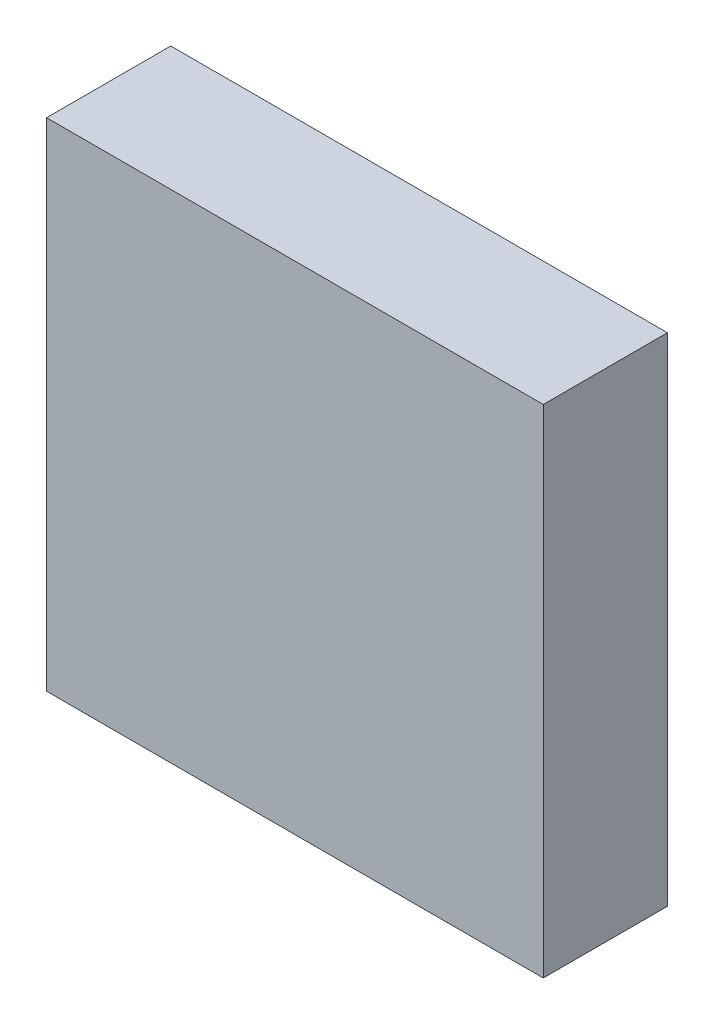
ISO-10303-21;
HEADER;
FILE_DESCRIPTION(('STEP AP214'),'2;1');
FILE_NAME('part.step','',(''),(''),'','','');
FILE_SCHEMA(('AUTOMOTIVE_DESIGN { 1 0 10303 214 1 1 1 1 }'));
ENDSEC;
DATA;
#1=APPLICATION_CONTEXT('core data for automotive mechanical design processes');
#2=APPLICATION_PROTOCOL_DEFINITION('international standard','automotive_design',2000,#1);
#3=PRODUCT_CONTEXT('',#1,'mechanical');
#4=PRODUCT('Part','Part','',(#3));
#5=PRODUCT_RELATED_PRODUCT_CATEGORY('part','',(#4));
#6=PRODUCT_DEFINITION_FORMATION('','',#4);
#7=PRODUCT_DEFINITION_CONTEXT('part definition',#1,'design');
#8=PRODUCT_DEFINITION('design','',#6,#7);
#9=PRODUCT_DEFINITION_SHAPE('','',#8);
#10=(LENGTH_UNIT() NAMED_UNIT(*) SI_UNIT(.MILLI.,.METRE.));
#11=(NAMED_UNIT(*) PLANE_ANGLE_UNIT() SI_UNIT($,.RADIAN.));
#12=(NAMED_UNIT(*) SI_UNIT($,.STERADIAN.) SOLID_ANGLE_UNIT());
#13=UNCERTAINTY_MEASURE_WITH_UNIT(LENGTH_MEASURE(1.E-05),#10,'distance_accuracy_value','');
#14=(GEOMETRIC_REPRESENTATION_CONTEXT(3) GLOBAL_UNCERTAINTY_ASSIGNED_CONTEXT((#13)) GLOBAL_UNIT_ASSIGNED_CONTEXT((#10,
#11,#12)) REPRESENTATION_CONTEXT('',''));
#15=CARTESIAN_POINT('',(0.,0.,0.));
#16=DIRECTION('',(0.,0.,1.));
#17=DIRECTION('',(1.,0.,0.));
#18=AXIS2_PLACEMENT_3D('',#15,#16,#17);
#19=CARTESIAN_POINT('',(-18.6771981276352,20.8309708995125,-0.87499883212488));
#20=CARTESIAN_POINT('',(-15.0771981276352,20.8309707421515,-0.874998832124894));
#21=CARTESIAN_POINT('',(-18.6771981276352,20.8309708208321,0.025001167875118));
#22=CARTESIAN_POINT('',(-15.0771981276352,20.8309706634711,0.0250011678751042));
#23=(BOUNDED_SURFACE() B_SPLINE_SURFACE(1,1,((#19,#20),(#21,#22)),.UNSPECIFIED.,.F.,.F.,
.F.) B_SPLINE_SURFACE_WITH_KNOTS((2,2),(2,2),(-7.5E-05,0.000825),(-0.0033,0.0003),
.UNSPECIFIED.) GEOMETRIC_REPRESENTATION_ITEM() RATIONAL_B_SPLINE_SURFACE(((1.,1.),(1.,1.))) REPRESENTATION_ITEM('') SURFACE());
#24=CARTESIAN_POINT('',(-15.3771981276352,20.8309707487082,-0.799998832124893));
#25=CARTESIAN_POINT('',(-18.3771981276352,20.8309708798424,-0.799998832124881));
#26=(BOUNDED_CURVE() B_SPLINE_CURVE(1,(#24,#25),.UNSPECIFIED.,.F.,
.F.) B_SPLINE_CURVE_WITH_KNOTS((2,2),(0.,0.003),
.UNSPECIFIED.) CURVE() GEOMETRIC_REPRESENTATION_ITEM() RATIONAL_B_SPLINE_CURVE((1.,1.)) REPRESENTATION_ITEM(''));
#27=CARTESIAN_POINT('',(-15.3771981276352,20.8309707487082,-0.799998832124893));
#28=VERTEX_POINT('',#27);
#29=CARTESIAN_POINT('',(-18.3771981276352,20.8309708798424,-0.799998832124881));
#30=VERTEX_POINT('',#29);
#31=EDGE_CURVE('E128',#28,#30,#26,.T.);
#32=CARTESIAN_POINT('',(-18.3771981276352,20.8309708142753,-0.0499988321248832));
#33=CARTESIAN_POINT('',(-18.3771981276352,20.8309708798424,-0.799998832124881));
#34=(BOUNDED_CURVE() B_SPLINE_CURVE(1,(#32,#33),.UNSPECIFIED.,.F.,
.F.) B_SPLINE_CURVE_WITH_KNOTS((2,2),(0.,0.00075),
.UNSPECIFIED.) CURVE() GEOMETRIC_REPRESENTATION_ITEM() RATIONAL_B_SPLINE_CURVE((1.,1.)) REPRESENTATION_ITEM(''));
#35=CARTESIAN_POINT('',(-18.3771981276352,20.8309708142753,-0.0499988321248832));
#36=VERTEX_POINT('',#35);
#37=EDGE_CURVE('E115',#36,#30,#34,.T.);
#38=CARTESIAN_POINT('',(-15.3771981276352,20.8309706831412,-0.0499988321248945));
#39=CARTESIAN_POINT('',(-18.3771981276352,20.8309708142754,-0.049998832124883));
#40=(BOUNDED_CURVE() B_SPLINE_CURVE(1,(#38,#39),.UNSPECIFIED.,.F.,
.F.) B_SPLINE_CURVE_WITH_KNOTS((2,2),(0.,0.003),
.UNSPECIFIED.) CURVE() GEOMETRIC_REPRESENTATION_ITEM() RATIONAL_B_SPLINE_CURVE((1.,1.)) REPRESENTATION_ITEM(''));
#41=CARTESIAN_POINT('',(-15.3771981276352,20.8309706831412,-0.0499988321248945));
#42=VERTEX_POINT('',#41);
#43=EDGE_CURVE('E107',#42,#36,#40,.T.);
#44=CARTESIAN_POINT('',(-15.3771981276352,20.8309706831412,-0.0499988321248945));
#45=CARTESIAN_POINT('',(-15.3771981276352,20.8309707487082,-0.799998832124893));
#46=(BOUNDED_CURVE() B_SPLINE_CURVE(1,(#44,#45),.UNSPECIFIED.,.F.,
.F.) B_SPLINE_CURVE_WITH_KNOTS((2,2),(0.,0.00075),
.UNSPECIFIED.) CURVE() GEOMETRIC_REPRESENTATION_ITEM() RATIONAL_B_SPLINE_CURVE((1.,1.)) REPRESENTATION_ITEM(''));
#47=EDGE_CURVE('E11',#42,#28,#46,.T.);
#48=ORIENTED_EDGE('',*,*,#31,.T.);
#49=ORIENTED_EDGE('',*,*,#37,.F.);
#50=ORIENTED_EDGE('',*,*,#43,.F.);
#51=ORIENTED_EDGE('',*,*,#47,.T.);
#52=EDGE_LOOP('',(#48,#49,#50,#51));
#53=FACE_BOUND('',#52,.T.);
#54=ADVANCED_FACE('F17',(#53),#23,.T.);
#55=CARTESIAN_POINT('',(-15.3771981145218,21.130970755265,-0.874998805898073));
#56=CARTESIAN_POINT('',(-15.3771982718828,17.5309707552649,-0.874999120619915));
#57=CARTESIAN_POINT('',(-15.3771981145218,21.1309706765845,0.0250011941019255));
#58=CARTESIAN_POINT('',(-15.3771982718828,17.5309706765844,0.0250008793800834));
#59=(BOUNDED_SURFACE() B_SPLINE_SURFACE(1,1,((#55,#56),(#57,#58)),.UNSPECIFIED.,.F.,.F.,
.F.) B_SPLINE_SURFACE_WITH_KNOTS((2,2),(2,2),(-7.5E-05,0.000825),(-0.000300000000000009,
0.00330000000000008),
.UNSPECIFIED.) GEOMETRIC_REPRESENTATION_ITEM() RATIONAL_B_SPLINE_SURFACE(((1.,1.),(1.,1.))) REPRESENTATION_ITEM('') SURFACE());
#60=CARTESIAN_POINT('',(-15.3771982587694,17.8309706831412,-0.0499990943930964));
#61=CARTESIAN_POINT('',(-15.3771982587694,17.8309707487082,-0.799999094393094));
#62=(BOUNDED_CURVE() B_SPLINE_CURVE(1,(#60,#61),.UNSPECIFIED.,.F.,
.F.) B_SPLINE_CURVE_WITH_KNOTS((2,2),(0.,0.00075),
.UNSPECIFIED.) CURVE() GEOMETRIC_REPRESENTATION_ITEM() RATIONAL_B_SPLINE_CURVE((1.,1.)) REPRESENTATION_ITEM(''));
#63=CARTESIAN_POINT('',(-15.3771982587694,17.8309706831412,-0.0499990943930964));
#64=VERTEX_POINT('',#63);
#65=CARTESIAN_POINT('',(-15.3771982587694,17.8309707487082,-0.799999094393094));
#66=VERTEX_POINT('',#65);
#67=EDGE_CURVE('E79',#64,#66,#62,.T.);
#68=CARTESIAN_POINT('',(-15.3771981276352,20.8309707487082,-0.799998832124893));
#69=CARTESIAN_POINT('',(-15.3771982587694,17.8309707487082,-0.799999094393095));
#70=(BOUNDED_CURVE() B_SPLINE_CURVE(1,(#68,#69),.UNSPECIFIED.,.F.,
.F.) B_SPLINE_CURVE_WITH_KNOTS((2,2),(0.,0.003),
.UNSPECIFIED.) CURVE() GEOMETRIC_REPRESENTATION_ITEM() RATIONAL_B_SPLINE_CURVE((1.,1.)) REPRESENTATION_ITEM(''));
#71=EDGE_CURVE('E32',#28,#66,#70,.T.);
#72=CARTESIAN_POINT('',(-15.3771981276352,20.8309706831412,-0.0499988321248945));
#73=CARTESIAN_POINT('',(-15.3771982587694,17.8309706831412,-0.0499990943930963));
#74=(BOUNDED_CURVE() B_SPLINE_CURVE(1,(#72,#73),.UNSPECIFIED.,.F.,
.F.) B_SPLINE_CURVE_WITH_KNOTS((2,2),(0.,0.003),
.UNSPECIFIED.) CURVE() GEOMETRIC_REPRESENTATION_ITEM() RATIONAL_B_SPLINE_CURVE((1.,1.)) REPRESENTATION_ITEM(''));
#75=EDGE_CURVE('E116',#42,#64,#74,.T.);
#76=ORIENTED_EDGE('',*,*,#67,.T.);
#77=ORIENTED_EDGE('',*,*,#71,.F.);
#78=ORIENTED_EDGE('',*,*,#47,.F.);
#79=ORIENTED_EDGE('',*,*,#75,.T.);
#80=EDGE_LOOP('',(#76,#77,#78,#79));
#81=FACE_BOUND('',#80,.T.);
#82=ADVANCED_FACE('F226',(#81),#59,.T.);
#83=CARTESIAN_POINT('',(-15.0771981145218,21.1309707355948,-0.799998805898074));
#84=CARTESIAN_POINT('',(-18.6771981145218,21.1309708929558,-0.79999880589806));
#85=CARTESIAN_POINT('',(-15.0771982718828,17.5309707355948,-0.799999120619916));
#86=CARTESIAN_POINT('',(-18.6771982718828,17.5309708929558,-0.799999120619903));
#87=(BOUNDED_SURFACE() B_SPLINE_SURFACE(1,1,((#83,#84),(#85,#86)),.UNSPECIFIED.,.F.,.F.,
.F.) B_SPLINE_SURFACE_WITH_KNOTS((2,2),(2,2),(-0.000300000000000047,0.0033),
(-0.000300000000000005,0.00330000000000004),
.UNSPECIFIED.) GEOMETRIC_REPRESENTATION_ITEM() RATIONAL_B_SPLINE_SURFACE(((1.,1.),(1.,1.))) REPRESENTATION_ITEM('') SURFACE());
#88=CARTESIAN_POINT('',(-17.8771981576868,20.1434708579867,-0.799998892228013));
#89=CARTESIAN_POINT('',(-18.0646981576868,20.1434708661826,-0.799998892228012));
#90=CARTESIAN_POINT('',(-18.0646981494909,20.3309708661826,-0.799998875836249));
#91=CARTESIAN_POINT('',(-18.064698141295,20.5184708661826,-0.799998859444486));
#92=CARTESIAN_POINT('',(-17.877198141295,20.5184708579867,-0.799998859444487));
#93=(BOUNDED_CURVE() B_SPLINE_CURVE(2,(#88,#89,#90,#91,#92),.UNSPECIFIED.,.F.,
.F.) B_SPLINE_CURVE_WITH_KNOTS((3,2,3),(0.,1.57079632679495,3.1415926535898),
.UNSPECIFIED.) CURVE() GEOMETRIC_REPRESENTATION_ITEM() RATIONAL_B_SPLINE_CURVE((1.,
0.707106781186575,1.,0.70710678118663,1.)) REPRESENTATION_ITEM(''));
#94=CARTESIAN_POINT('',(-17.8771981576868,20.1434708579867,-0.799998892228013));
#95=VERTEX_POINT('',#94);
#96=CARTESIAN_POINT('',(-17.877198141295,20.5184708579867,-0.799998859444487));
#97=VERTEX_POINT('',#96);
#98=EDGE_CURVE('E73',#95,#97,#93,.T.);
#99=CARTESIAN_POINT('',(-17.877198141295,20.5184708579867,-0.799998859444487));
#100=CARTESIAN_POINT('',(-17.689698141295,20.5184708497908,-0.799998859444489));
#101=CARTESIAN_POINT('',(-17.6896981494909,20.3309708497908,-0.799998875836251));
#102=CARTESIAN_POINT('',(-17.6896981576868,20.1434708497908,-0.799998892228014));
#103=CARTESIAN_POINT('',(-17.8771981576868,20.1434708579867,-0.799998892228013));
#104=(BOUNDED_CURVE() B_SPLINE_CURVE(2,(#99,#100,#101,#102,#103),.UNSPECIFIED.,.F.,
.F.) B_SPLINE_CURVE_WITH_KNOTS((3,2,3),(3.1415926535898,4.71238898038474,6.28318530717969),
.UNSPECIFIED.) CURVE() GEOMETRIC_REPRESENTATION_ITEM() RATIONAL_B_SPLINE_CURVE((1.,
0.707106781186513,1.,0.707106781186562,1.)) REPRESENTATION_ITEM(''));
#105=EDGE_CURVE('E77',#97,#95,#104,.T.);
#106=CARTESIAN_POINT('',(-15.3771982587694,17.8309707487082,-0.799999094393094));
#107=CARTESIAN_POINT('',(-18.3771982587694,17.8309708798424,-0.799999094393082));
#108=(BOUNDED_CURVE() B_SPLINE_CURVE(1,(#106,#107),.UNSPECIFIED.,.F.,
.F.) B_SPLINE_CURVE_WITH_KNOTS((2,2),(0.,0.003),
.UNSPECIFIED.) CURVE() GEOMETRIC_REPRESENTATION_ITEM() RATIONAL_B_SPLINE_CURVE((1.,1.)) REPRESENTATION_ITEM(''));
#109=CARTESIAN_POINT('',(-18.3771982587694,17.8309708798424,-0.799999094393083));
#110=VERTEX_POINT('',#109);
#111=EDGE_CURVE('E155',#66,#110,#108,.T.);
#112=CARTESIAN_POINT('',(-18.3771981276352,20.8309708798424,-0.799998832124881));
#113=CARTESIAN_POINT('',(-18.3771982587694,17.8309708798424,-0.799999094393083));
#114=(BOUNDED_CURVE() B_SPLINE_CURVE(1,(#112,#113),.UNSPECIFIED.,.F.,
.F.) B_SPLINE_CURVE_WITH_KNOTS((2,2),(0.,0.003),
.UNSPECIFIED.) CURVE() GEOMETRIC_REPRESENTATION_ITEM() RATIONAL_B_SPLINE_CURVE((1.,1.)) REPRESENTATION_ITEM(''));
#115=EDGE_CURVE('E23',#30,#110,#114,.T.);
#116=ORIENTED_EDGE('',*,*,#98,.F.);
#117=ORIENTED_EDGE('',*,*,#105,.F.);
#118=EDGE_LOOP('',(#116,#117));
#119=FACE_BOUND('',#118,.T.);
#120=ORIENTED_EDGE('',*,*,#31,.F.);
#121=ORIENTED_EDGE('',*,*,#71,.T.);
#122=ORIENTED_EDGE('',*,*,#111,.T.);
#123=ORIENTED_EDGE('',*,*,#115,.F.);
#124=EDGE_LOOP('',(#120,#121,#122,#123));
#125=FACE_BOUND('',#124,.T.);
#126=ADVANCED_FACE('F19',(#119,#125),#87,.T.);
#127=CARTESIAN_POINT('',(-18.3771981145218,21.1309708077186,0.0250011941019368));
#128=CARTESIAN_POINT('',(-18.3771982718828,17.5309708077186,0.0250008793800946));
#129=CARTESIAN_POINT('',(-18.3771981145218,21.1309708863991,-0.874998805898061));
#130=CARTESIAN_POINT('',(-18.3771982718828,17.5309708863991,-0.874999120619903));
#131=(BOUNDED_SURFACE() B_SPLINE_SURFACE(1,1,((#127,#128),(#129,#130)),.UNSPECIFIED.,.F.,.F.,
.F.) B_SPLINE_SURFACE_WITH_KNOTS((2,2),(2,2),(-7.5E-05,0.000825),(-0.000300000000000055,0.0033),
.UNSPECIFIED.) GEOMETRIC_REPRESENTATION_ITEM() RATIONAL_B_SPLINE_SURFACE(((1.,1.),(1.,1.))) REPRESENTATION_ITEM('') SURFACE());
#132=CARTESIAN_POINT('',(-18.3771981276352,20.8309708142753,-0.0499988321248832));
#133=CARTESIAN_POINT('',(-18.3771982587694,17.8309708142754,-0.049999094393085));
#134=(BOUNDED_CURVE() B_SPLINE_CURVE(1,(#132,#133),.UNSPECIFIED.,.F.,
.F.) B_SPLINE_CURVE_WITH_KNOTS((2,2),(0.,0.0029999999999999),
.UNSPECIFIED.) CURVE() GEOMETRIC_REPRESENTATION_ITEM() RATIONAL_B_SPLINE_CURVE((1.,1.)) REPRESENTATION_ITEM(''));
#135=CARTESIAN_POINT('',(-18.3771982587694,17.8309708142754,-0.0499990943930852));
#136=VERTEX_POINT('',#135);
#137=EDGE_CURVE('E94',#36,#136,#134,.T.);
#138=CARTESIAN_POINT('',(-18.3771982587694,17.8309708142754,-0.0499990943930852));
#139=CARTESIAN_POINT('',(-18.3771982587694,17.8309708798425,-0.799999094393083));
#140=(BOUNDED_CURVE() B_SPLINE_CURVE(1,(#138,#139),.UNSPECIFIED.,.F.,
.F.) B_SPLINE_CURVE_WITH_KNOTS((2,2),(0.,0.00075),
.UNSPECIFIED.) CURVE() GEOMETRIC_REPRESENTATION_ITEM() RATIONAL_B_SPLINE_CURVE((1.,1.)) REPRESENTATION_ITEM(''));
#141=EDGE_CURVE('E143',#136,#110,#140,.T.);
#142=ORIENTED_EDGE('',*,*,#137,.F.);
#143=ORIENTED_EDGE('',*,*,#37,.T.);
#144=ORIENTED_EDGE('',*,*,#115,.T.);
#145=ORIENTED_EDGE('',*,*,#141,.F.);
#146=EDGE_LOOP('',(#142,#143,#144,#145));
#147=FACE_BOUND('',#146,.T.);
#148=ADVANCED_FACE('F221',(#147),#131,.T.);
#149=CARTESIAN_POINT('',(-15.0771982718828,17.5309706700278,-0.0499991206199176));
#150=CARTESIAN_POINT('',(-18.6771982718828,17.5309708273888,-0.0499991206199039));
#151=CARTESIAN_POINT('',(-15.0771981145218,21.1309706700278,-0.0499988058980755));
#152=CARTESIAN_POINT('',(-18.6771981145218,21.1309708273888,-0.0499988058980617));
#153=(BOUNDED_SURFACE() B_SPLINE_SURFACE(1,1,((#149,#150),(#151,#152)),.UNSPECIFIED.,.F.,.F.,
.F.) B_SPLINE_SURFACE_WITH_KNOTS((2,2),(2,2),(-0.000300000000000005,0.0033),
(-0.000300000000000005,0.00330000000000004),
.UNSPECIFIED.) GEOMETRIC_REPRESENTATION_ITEM() RATIONAL_B_SPLINE_SURFACE(((1.,1.),(1.,1.))) REPRESENTATION_ITEM('') SURFACE());
#154=CARTESIAN_POINT('',(-15.3771982587694,17.8309706831412,-0.0499990943930964));
#155=CARTESIAN_POINT('',(-18.3771982587694,17.8309708142754,-0.0499990943930849));
#156=(BOUNDED_CURVE() B_SPLINE_CURVE(1,(#154,#155),.UNSPECIFIED.,.F.,
.F.) B_SPLINE_CURVE_WITH_KNOTS((2,2),(0.,0.003),
.UNSPECIFIED.) CURVE() GEOMETRIC_REPRESENTATION_ITEM() RATIONAL_B_SPLINE_CURVE((1.,1.)) REPRESENTATION_ITEM(''));
#157=EDGE_CURVE('E135',#64,#136,#156,.T.);
#158=ORIENTED_EDGE('',*,*,#137,.T.);
#159=ORIENTED_EDGE('',*,*,#157,.F.);
#160=ORIENTED_EDGE('',*,*,#75,.F.);
#161=ORIENTED_EDGE('',*,*,#43,.T.);
#162=EDGE_LOOP('',(#158,#159,#160,#161));
#163=FACE_BOUND('',#162,.T.);
#164=ADVANCED_FACE('F218',(#163),#153,.T.);
#165=CARTESIAN_POINT('',(-18.6771982587694,17.8309708208321,0.025000905606916));
#166=CARTESIAN_POINT('',(-15.0771982587694,17.8309706634711,0.0250009056069023));
#167=CARTESIAN_POINT('',(-18.6771982587694,17.8309708995125,-0.874999094393082));
#168=CARTESIAN_POINT('',(-15.0771982587694,17.8309707421515,-0.874999094393095));
#169=(BOUNDED_SURFACE() B_SPLINE_SURFACE(1,1,((#165,#166),(#167,#168)),.UNSPECIFIED.,.F.,.F.,
.F.) B_SPLINE_SURFACE_WITH_KNOTS((2,2),(2,2),(-7.5E-05,0.000825),(-0.0033,0.0003),
.UNSPECIFIED.) GEOMETRIC_REPRESENTATION_ITEM() RATIONAL_B_SPLINE_SURFACE(((1.,1.),(1.,1.))) REPRESENTATION_ITEM('') SURFACE());
#170=ORIENTED_EDGE('',*,*,#67,.F.);
#171=ORIENTED_EDGE('',*,*,#157,.T.);
#172=ORIENTED_EDGE('',*,*,#141,.T.);
#173=ORIENTED_EDGE('',*,*,#111,.F.);
#174=EDGE_LOOP('',(#170,#171,#172,#173));
#175=FACE_BOUND('',#174,.T.);
#176=ADVANCED_FACE('F224',(#175),#169,.T.);
#177=CARTESIAN_POINT('',(-17.877198141295,20.5184708492444,-0.699998859444487));
#178=CARTESIAN_POINT('',(-17.689698141295,20.5184708410485,-0.699998859444488));
#179=CARTESIAN_POINT('',(-17.6896981494909,20.3309708410485,-0.699998875836251));
#180=CARTESIAN_POINT('',(-17.6896981576868,20.1434708410485,-0.699998892228014));
#181=CARTESIAN_POINT('',(-17.8771981576868,20.1434708492444,-0.699998892228013));
#182=CARTESIAN_POINT('',(-18.0646981576868,20.1434708574403,-0.699998892228012));
#183=CARTESIAN_POINT('',(-18.0646981494909,20.3309708574403,-0.699998875836249));
#184=CARTESIAN_POINT('',(-18.064698141295,20.5184708574403,-0.699998859444487));
#185=CARTESIAN_POINT('',(-17.877198141295,20.5184708492444,-0.699998859444487));
#186=CARTESIAN_POINT('',(-17.877198141295,20.5184708579867,-0.799998859444487));
#187=CARTESIAN_POINT('',(-17.689698141295,20.5184708497908,-0.799998859444489));
#188=CARTESIAN_POINT('',(-17.6896981494909,20.3309708497908,-0.799998875836251));
#189=CARTESIAN_POINT('',(-17.6896981576868,20.1434708497908,-0.799998892228014));
#190=CARTESIAN_POINT('',(-17.8771981576868,20.1434708579867,-0.799998892228013));
#191=CARTESIAN_POINT('',(-18.0646981576868,20.1434708661826,-0.799998892228012));
#192=CARTESIAN_POINT('',(-18.0646981494909,20.3309708661826,-0.799998875836249));
#193=CARTESIAN_POINT('',(-18.064698141295,20.5184708661826,-0.799998859444487));
#194=CARTESIAN_POINT('',(-17.877198141295,20.5184708579867,-0.799998859444487));
#195=(BOUNDED_SURFACE() B_SPLINE_SURFACE(1,2,((#177,#178,#179,#180,#181,#182,#183,#184,#185),
(#186,#187,#188,#189,#190,#191,#192,#193,#194)),.UNSPECIFIED.,.F.,.T.,
.F.) B_SPLINE_SURFACE_WITH_KNOTS((2,2),(3,2,2,2,3),(0.,0.533333333333336),(-3.14159265358979,
-1.5707963267949,0.,1.5707963267949,3.14159265358979),
.UNSPECIFIED.) GEOMETRIC_REPRESENTATION_ITEM() RATIONAL_B_SPLINE_SURFACE(((1.,0.707106781186548,
1.,0.707106781186548,1.,0.707106781186548,1.,0.707106781186548,1.),(1.,0.707106781186548,1.,
0.707106781186548,1.,0.707106781186548,1.,0.707106781186548,1.))) REPRESENTATION_ITEM('') SURFACE());
#196=CARTESIAN_POINT('',(-17.8771981576868,20.1434708492444,-0.699998892228013));
#197=CARTESIAN_POINT('',(-18.0646981576868,20.1434708574403,-0.699998892228013));
#198=CARTESIAN_POINT('',(-18.0646981494909,20.3309708574403,-0.699998875836249));
#199=CARTESIAN_POINT('',(-18.064698141295,20.5184708574403,-0.699998859444486));
#200=CARTESIAN_POINT('',(-17.877198141295,20.5184708492444,-0.699998859444487));
#201=(BOUNDED_CURVE() B_SPLINE_CURVE(2,(#196,#197,#198,#199,#200),.UNSPECIFIED.,.F.,
.F.) B_SPLINE_CURVE_WITH_KNOTS((3,2,3),(0.,1.57079632679495,3.1415926535898),
.UNSPECIFIED.) CURVE() GEOMETRIC_REPRESENTATION_ITEM() RATIONAL_B_SPLINE_CURVE((1.,
0.707106781186546,1.,0.70710678118663,1.)) REPRESENTATION_ITEM(''));
#202=CARTESIAN_POINT('',(-17.8771981576868,20.1434708492444,-0.699998892228013));
#203=VERTEX_POINT('',#202);
#204=CARTESIAN_POINT('',(-17.877198141295,20.5184708492444,-0.699998859444487));
#205=VERTEX_POINT('',#204);
#206=EDGE_CURVE('E98',#203,#205,#201,.T.);
#207=CARTESIAN_POINT('',(-17.877198141295,20.5184708492444,-0.699998859444487));
#208=CARTESIAN_POINT('',(-17.689698141295,20.5184708410485,-0.699998859444488));
#209=CARTESIAN_POINT('',(-17.6896981494909,20.3309708410485,-0.699998875836251));
#210=CARTESIAN_POINT('',(-17.6896981576868,20.1434708410485,-0.699998892228012));
#211=CARTESIAN_POINT('',(-17.8771981576868,20.1434708492444,-0.699998892228013));
#212=(BOUNDED_CURVE() B_SPLINE_CURVE(2,(#207,#208,#209,#210,#211),.UNSPECIFIED.,.F.,
.F.) B_SPLINE_CURVE_WITH_KNOTS((3,2,3),(3.1415926535898,4.71238898038474,6.28318530717969),
.UNSPECIFIED.) CURVE() GEOMETRIC_REPRESENTATION_ITEM() RATIONAL_B_SPLINE_CURVE((1.,
0.707106781186513,1.,0.707106781186562,1.)) REPRESENTATION_ITEM(''));
#213=EDGE_CURVE('E88',#205,#203,#212,.T.);
#214=CARTESIAN_POINT('',(-17.877198141295,20.5184708492444,-0.699998859444487));
#215=CARTESIAN_POINT('',(-17.877198141295,20.5184708579867,-0.799998859444487));
#216=(BOUNDED_CURVE() B_SPLINE_CURVE(1,(#214,#215),.UNSPECIFIED.,.F.,
.F.) B_SPLINE_CURVE_WITH_KNOTS((2,2),(0.,0.533333333333336),
.UNSPECIFIED.) CURVE() GEOMETRIC_REPRESENTATION_ITEM() RATIONAL_B_SPLINE_CURVE((1.,1.)) REPRESENTATION_ITEM(''));
#217=EDGE_CURVE('E69',#205,#97,#216,.T.);
#218=ORIENTED_EDGE('',*,*,#206,.F.);
#219=ORIENTED_EDGE('',*,*,#213,.F.);
#220=ORIENTED_EDGE('',*,*,#217,.T.);
#221=ORIENTED_EDGE('',*,*,#105,.T.);
#222=ORIENTED_EDGE('',*,*,#98,.T.);
#223=ORIENTED_EDGE('',*,*,#217,.F.);
#224=EDGE_LOOP('',(#218,#219,#220,#221,#222,#223));
#225=FACE_BOUND('',#224,.T.);
#226=ADVANCED_FACE('F81',(#225),#195,.T.);
#227=CARTESIAN_POINT('',(-17.6521981396558,20.5559708394094,-0.699998856166136));
#228=CARTESIAN_POINT('',(-18.1021981396559,20.5559708590795,-0.699998856166134));
#229=CARTESIAN_POINT('',(-17.6521981593259,20.1059708394093,-0.699998895506366));
#230=CARTESIAN_POINT('',(-18.102198159326,20.1059708590794,-0.699998895506364));
#231=(BOUNDED_SURFACE() B_SPLINE_SURFACE(1,1,((#227,#228),(#229,#230)),.UNSPECIFIED.,.F.,.F.,
.F.) B_SPLINE_SURFACE_WITH_KNOTS((2,2),(2,2),(-0.000225000000000017,0.000225000000000021),
(-0.000225000000000021,0.000225000000000025),
.UNSPECIFIED.) GEOMETRIC_REPRESENTATION_ITEM() RATIONAL_B_SPLINE_SURFACE(((1.,1.),(1.,1.))) REPRESENTATION_ITEM('') SURFACE());
#232=ORIENTED_EDGE('',*,*,#206,.T.);
#233=ORIENTED_EDGE('',*,*,#213,.T.);
#234=EDGE_LOOP('',(#232,#233));
#235=FACE_BOUND('',#234,.T.);
#236=ADVANCED_FACE('F251',(#235),#231,.T.);
#237=CLOSED_SHELL('',(#54,#82,#126,#148,#164,#176,#226,#236));
#238=MANIFOLD_SOLID_BREP('B1',#237);
#239=ADVANCED_BREP_SHAPE_REPRESENTATION('',(#18,#238),#14);
#240=SHAPE_DEFINITION_REPRESENTATION(#9,#239);
ENDSEC;
END-ISO-10303-21;
